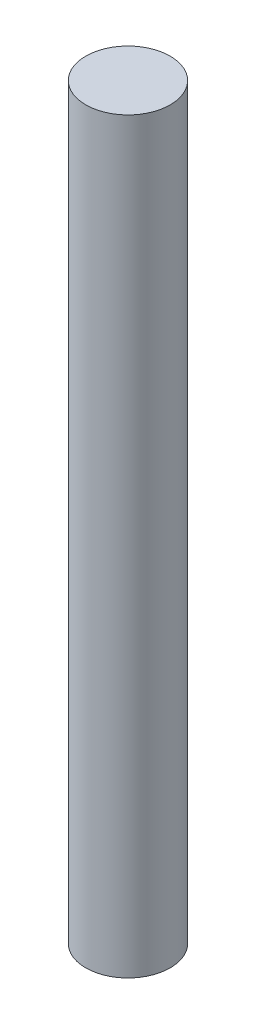
ISO-10303-21;
HEADER;
FILE_DESCRIPTION(('STEP AP214'),'2;1');
FILE_NAME('part.step','',(''),(''),'','','');
FILE_SCHEMA(('AUTOMOTIVE_DESIGN { 1 0 10303 214 1 1 1 1 }'));
ENDSEC;
DATA;
#1=APPLICATION_CONTEXT('core data for automotive mechanical design processes');
#2=APPLICATION_PROTOCOL_DEFINITION('international standard','automotive_design',2000,#1);
#3=PRODUCT_CONTEXT('',#1,'mechanical');
#4=PRODUCT('Part','Part','',(#3));
#5=PRODUCT_RELATED_PRODUCT_CATEGORY('part','',(#4));
#6=PRODUCT_DEFINITION_FORMATION('','',#4);
#7=PRODUCT_DEFINITION_CONTEXT('part definition',#1,'design');
#8=PRODUCT_DEFINITION('design','',#6,#7);
#9=PRODUCT_DEFINITION_SHAPE('','',#8);
#10=(LENGTH_UNIT() NAMED_UNIT(*) SI_UNIT(.MILLI.,.METRE.));
#11=(NAMED_UNIT(*) PLANE_ANGLE_UNIT() SI_UNIT($,.RADIAN.));
#12=(NAMED_UNIT(*) SI_UNIT($,.STERADIAN.) SOLID_ANGLE_UNIT());
#13=UNCERTAINTY_MEASURE_WITH_UNIT(LENGTH_MEASURE(1.E-05),#10,'distance_accuracy_value','');
#14=(GEOMETRIC_REPRESENTATION_CONTEXT(3) GLOBAL_UNCERTAINTY_ASSIGNED_CONTEXT((#13)) GLOBAL_UNIT_ASSIGNED_CONTEXT((#10,
#11,#12)) REPRESENTATION_CONTEXT('',''));
#15=CARTESIAN_POINT('',(0.,0.,0.));
#16=DIRECTION('',(0.,0.,1.));
#17=DIRECTION('',(1.,0.,0.));
#18=AXIS2_PLACEMENT_3D('',#15,#16,#17);
#19=CARTESIAN_POINT('',(0.,100.,0.));
#20=DIRECTION('',(0.,-1.,0.));
#21=DIRECTION('',(0.,0.,-1.));
#22=AXIS2_PLACEMENT_3D('',#19,#20,#21);
#23=CYLINDRICAL_SURFACE('',#22,4.);
#24=CARTESIAN_POINT('',(0.,29.1961144116487,0.));
#25=DIRECTION('',(0.,1.,0.));
#26=DIRECTION('',(0.,0.,1.));
#27=AXIS2_PLACEMENT_3D('',#24,#25,#26);
#28=CIRCLE('',#27,4.);
#29=CARTESIAN_POINT('',(0.,29.1961144116487,4.));
#30=VERTEX_POINT('',#29);
#31=EDGE_CURVE('E42',#30,#30,#28,.T.);
#32=ORIENTED_EDGE('',*,*,#31,.T.);
#33=EDGE_LOOP('',(#32));
#34=FACE_BOUND('',#33,.T.);
#35=CARTESIAN_POINT('',(0.,100.,0.));
#36=DIRECTION('',(0.,1.,0.));
#37=DIRECTION('',(0.,0.,1.));
#38=AXIS2_PLACEMENT_3D('',#35,#36,#37);
#39=CIRCLE('',#38,4.);
#40=CARTESIAN_POINT('',(0.,100.,4.));
#41=VERTEX_POINT('',#40);
#42=EDGE_CURVE('E10',#41,#41,#39,.T.);
#43=ORIENTED_EDGE('',*,*,#42,.F.);
#44=EDGE_LOOP('',(#43));
#45=FACE_BOUND('',#44,.T.);
#46=ADVANCED_FACE('F39',(#34,#45),#23,.T.);
#47=CARTESIAN_POINT('',(0.,100.,0.));
#48=DIRECTION('',(0.,1.,0.));
#49=DIRECTION('',(0.,0.,1.));
#50=AXIS2_PLACEMENT_3D('',#47,#48,#49);
#51=PLANE('',#50);
#52=ORIENTED_EDGE('',*,*,#42,.T.);
#53=EDGE_LOOP('',(#52));
#54=FACE_BOUND('',#53,.T.);
#55=ADVANCED_FACE('F55',(#54),#51,.T.);
#56=CARTESIAN_POINT('',(20.543807812357,29.1961144116487,4.08923337800627));
#57=DIRECTION('',(0.,1.,0.));
#58=DIRECTION('',(0.,0.,1.));
#59=AXIS2_PLACEMENT_3D('',#56,#57,#58);
#60=PLANE('',#59);
#61=ORIENTED_EDGE('',*,*,#31,.F.);
#62=EDGE_LOOP('',(#61));
#63=FACE_BOUND('',#62,.T.);
#64=ADVANCED_FACE('F53',(#63),#60,.F.);
#65=CLOSED_SHELL('',(#46,#55,#64));
#66=MANIFOLD_SOLID_BREP('B2',#65);
#67=ADVANCED_BREP_SHAPE_REPRESENTATION('',(#18,#66),#14);
#68=SHAPE_DEFINITION_REPRESENTATION(#9,#67);
ENDSEC;
END-ISO-10303-21;
